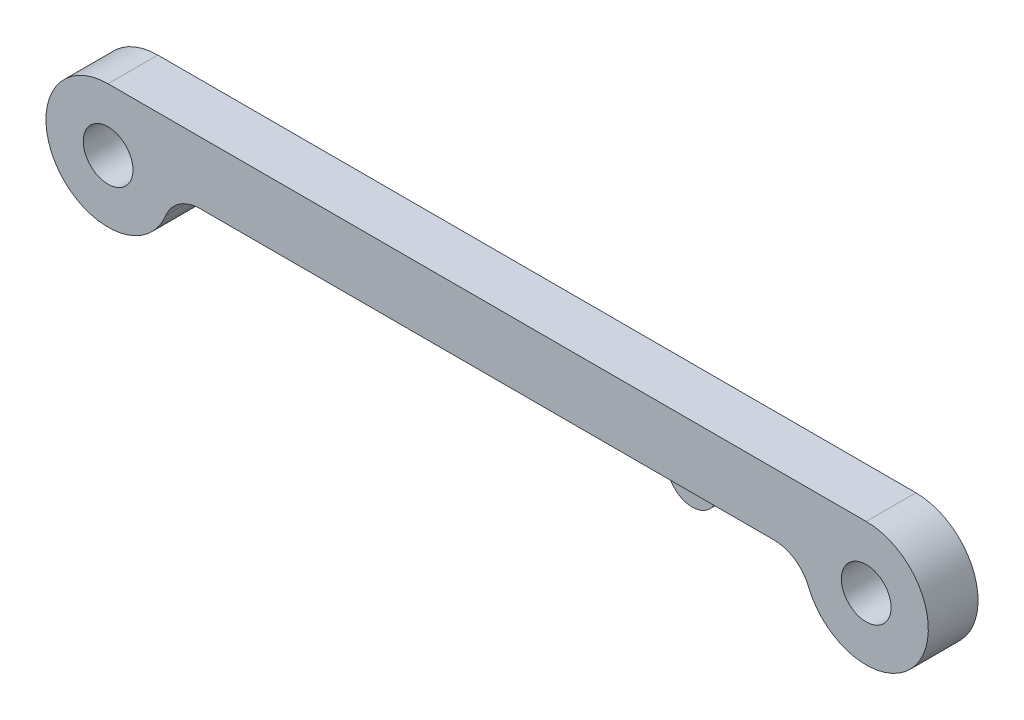
ISO-10303-21;
HEADER;
FILE_DESCRIPTION(('STEP AP214'),'2;1');
FILE_NAME('part.step','',(''),(''),'','','');
FILE_SCHEMA(('AUTOMOTIVE_DESIGN { 1 0 10303 214 1 1 1 1 }'));
ENDSEC;
DATA;
#1=APPLICATION_CONTEXT('core data for automotive mechanical design processes');
#2=APPLICATION_PROTOCOL_DEFINITION('international standard','automotive_design',2000,#1);
#3=PRODUCT_CONTEXT('',#1,'mechanical');
#4=PRODUCT('Part','Part','',(#3));
#5=PRODUCT_RELATED_PRODUCT_CATEGORY('part','',(#4));
#6=PRODUCT_DEFINITION_FORMATION('','',#4);
#7=PRODUCT_DEFINITION_CONTEXT('part definition',#1,'design');
#8=PRODUCT_DEFINITION('design','',#6,#7);
#9=PRODUCT_DEFINITION_SHAPE('','',#8);
#10=(LENGTH_UNIT() NAMED_UNIT(*) SI_UNIT(.MILLI.,.METRE.));
#11=(NAMED_UNIT(*) PLANE_ANGLE_UNIT() SI_UNIT($,.RADIAN.));
#12=(NAMED_UNIT(*) SI_UNIT($,.STERADIAN.) SOLID_ANGLE_UNIT());
#13=UNCERTAINTY_MEASURE_WITH_UNIT(LENGTH_MEASURE(1.E-05),#10,'distance_accuracy_value','');
#14=(GEOMETRIC_REPRESENTATION_CONTEXT(3) GLOBAL_UNCERTAINTY_ASSIGNED_CONTEXT((#13)) GLOBAL_UNIT_ASSIGNED_CONTEXT((#10,
#11,#12)) REPRESENTATION_CONTEXT('',''));
#15=CARTESIAN_POINT('',(0.,0.,0.));
#16=DIRECTION('',(0.,0.,1.));
#17=DIRECTION('',(1.,0.,0.));
#18=AXIS2_PLACEMENT_3D('',#15,#16,#17);
#19=CARTESIAN_POINT('',(-55.8049486568332,-3.5,4.));
#20=DIRECTION('',(0.,0.,1.));
#21=DIRECTION('',(1.,0.,0.));
#22=AXIS2_PLACEMENT_3D('',#19,#20,#21);
#23=PLANE('',#22);
#24=CARTESIAN_POINT('',(-63.2211471439288,-0.499999999999996,4.));
#25=DIRECTION('',(0.,0.,1.));
#26=DIRECTION('',(1.,0.,0.));
#27=AXIS2_PLACEMENT_3D('',#24,#25,#26);
#28=CIRCLE('',#27,2.);
#29=CARTESIAN_POINT('',(-61.2211471439288,-0.499999999999996,4.));
#30=VERTEX_POINT('',#29);
#31=EDGE_CURVE('E168',#30,#30,#28,.T.);
#32=ORIENTED_EDGE('',*,*,#31,.F.);
#33=EDGE_LOOP('',(#32));
#34=FACE_BOUND('',#33,.T.);
#35=CARTESIAN_POINT('',(-55.8049486568332,-3.5,4.));
#36=DIRECTION('',(0.,0.,-1.));
#37=DIRECTION('',(1.,0.,0.));
#38=AXIS2_PLACEMENT_3D('',#35,#36,#37);
#39=CIRCLE('',#38,3.);
#40=CARTESIAN_POINT('',(-58.586023089494,-2.375,4.));
#41=VERTEX_POINT('',#40);
#42=CARTESIAN_POINT('',(-55.8049486568332,-0.499999999999997,4.));
#43=VERTEX_POINT('',#42);
#44=EDGE_CURVE('E174',#41,#43,#39,.T.);
#45=ORIENTED_EDGE('',*,*,#44,.T.);
#46=DIRECTION('',(1.,0.,0.));
#47=VECTOR('',#46,1.);
#48=CARTESIAN_POINT('',(-55.8049486568332,-0.499999999999997,4.));
#49=LINE('',#48,#47);
#50=CARTESIAN_POINT('',(-9.63734563102448,-0.499999999999997,4.));
#51=VERTEX_POINT('',#50);
#52=EDGE_CURVE('E177',#43,#51,#49,.T.);
#53=ORIENTED_EDGE('',*,*,#52,.T.);
#54=CARTESIAN_POINT('',(-9.63734563102448,-3.5,4.));
#55=DIRECTION('',(0.,0.,-1.));
#56=DIRECTION('',(-1.,0.,0.));
#57=AXIS2_PLACEMENT_3D('',#54,#55,#56);
#58=CIRCLE('',#57,3.);
#59=CARTESIAN_POINT('',(-6.85627119836361,-2.375,4.));
#60=VERTEX_POINT('',#59);
#61=EDGE_CURVE('E180',#51,#60,#58,.T.);
#62=ORIENTED_EDGE('',*,*,#61,.T.);
#63=CARTESIAN_POINT('',(-2.22114714392882,-0.499999999999997,4.));
#64=DIRECTION('',(0.,0.,1.));
#65=DIRECTION('',(1.,0.,0.));
#66=AXIS2_PLACEMENT_3D('',#63,#64,#65);
#67=CIRCLE('',#66,5.);
#68=CARTESIAN_POINT('',(-2.22114714392882,4.5,4.));
#69=VERTEX_POINT('',#68);
#70=EDGE_CURVE('E182',#60,#69,#67,.T.);
#71=ORIENTED_EDGE('',*,*,#70,.T.);
#72=DIRECTION('',(-1.,0.,0.));
#73=VECTOR('',#72,1.);
#74=CARTESIAN_POINT('',(-63.2211471439288,4.5,4.));
#75=LINE('',#74,#73);
#76=CARTESIAN_POINT('',(-63.2211471439288,4.5,4.));
#77=VERTEX_POINT('',#76);
#78=EDGE_CURVE('E184',#69,#77,#75,.T.);
#79=ORIENTED_EDGE('',*,*,#78,.T.);
#80=CARTESIAN_POINT('',(-63.2211471439288,-0.499999999999996,4.));
#81=DIRECTION('',(0.,0.,1.));
#82=DIRECTION('',(1.,0.,0.));
#83=AXIS2_PLACEMENT_3D('',#80,#81,#82);
#84=CIRCLE('',#83,5.);
#85=EDGE_CURVE('E186',#77,#41,#84,.T.);
#86=ORIENTED_EDGE('',*,*,#85,.T.);
#87=EDGE_LOOP('',(#45,#53,#62,#71,#79,#86));
#88=FACE_BOUND('',#87,.T.);
#89=CARTESIAN_POINT('',(-2.22114714392882,-0.499999999999997,4.));
#90=DIRECTION('',(0.,0.,1.));
#91=DIRECTION('',(1.,0.,0.));
#92=AXIS2_PLACEMENT_3D('',#89,#90,#91);
#93=CIRCLE('',#92,2.);
#94=CARTESIAN_POINT('',(-0.221147143928817,-0.499999999999997,4.));
#95=VERTEX_POINT('',#94);
#96=EDGE_CURVE('E162',#95,#95,#93,.T.);
#97=ORIENTED_EDGE('',*,*,#96,.F.);
#98=EDGE_LOOP('',(#97));
#99=FACE_BOUND('',#98,.T.);
#100=ADVANCED_FACE('F36',(#34,#88,#99),#23,.T.);
#101=CARTESIAN_POINT('',(-55.8049486568332,-3.5,0.));
#102=DIRECTION('',(0.,0.,1.));
#103=DIRECTION('',(1.,0.,0.));
#104=AXIS2_PLACEMENT_3D('',#101,#102,#103);
#105=PLANE('',#104);
#106=CARTESIAN_POINT('',(-63.2211471439288,-0.499999999999996,0.));
#107=DIRECTION('',(0.,0.,1.));
#108=DIRECTION('',(1.,0.,0.));
#109=AXIS2_PLACEMENT_3D('',#106,#107,#108);
#110=CIRCLE('',#109,2.);
#111=CARTESIAN_POINT('',(-61.2211471439288,-0.499999999999996,0.));
#112=VERTEX_POINT('',#111);
#113=EDGE_CURVE('E165',#112,#112,#110,.T.);
#114=ORIENTED_EDGE('',*,*,#113,.T.);
#115=EDGE_LOOP('',(#114));
#116=FACE_BOUND('',#115,.T.);
#117=CARTESIAN_POINT('',(-55.8049486568332,-3.5,0.));
#118=DIRECTION('',(0.,0.,-1.));
#119=DIRECTION('',(1.,0.,0.));
#120=AXIS2_PLACEMENT_3D('',#117,#118,#119);
#121=CIRCLE('',#120,3.);
#122=CARTESIAN_POINT('',(-58.586023089494,-2.375,0.));
#123=VERTEX_POINT('',#122);
#124=CARTESIAN_POINT('',(-55.8049486568332,-0.499999999999997,0.));
#125=VERTEX_POINT('',#124);
#126=EDGE_CURVE('E171',#123,#125,#121,.T.);
#127=ORIENTED_EDGE('',*,*,#126,.F.);
#128=CARTESIAN_POINT('',(-63.2211471439288,-0.499999999999996,0.));
#129=DIRECTION('',(0.,0.,1.));
#130=DIRECTION('',(1.,0.,0.));
#131=AXIS2_PLACEMENT_3D('',#128,#129,#130);
#132=CIRCLE('',#131,5.);
#133=CARTESIAN_POINT('',(-63.2211471439288,4.5,0.));
#134=VERTEX_POINT('',#133);
#135=EDGE_CURVE('E178',#134,#123,#132,.T.);
#136=ORIENTED_EDGE('',*,*,#135,.F.);
#137=DIRECTION('',(-1.,0.,0.));
#138=VECTOR('',#137,1.);
#139=CARTESIAN_POINT('',(-63.2211471439288,4.5,0.));
#140=LINE('',#139,#138);
#141=CARTESIAN_POINT('',(-2.22114714392882,4.5,0.));
#142=VERTEX_POINT('',#141);
#143=EDGE_CURVE('E197',#142,#134,#140,.T.);
#144=ORIENTED_EDGE('',*,*,#143,.F.);
#145=CARTESIAN_POINT('',(-2.22114714392882,-0.499999999999997,0.));
#146=DIRECTION('',(0.,0.,1.));
#147=DIRECTION('',(1.,0.,0.));
#148=AXIS2_PLACEMENT_3D('',#145,#146,#147);
#149=CIRCLE('',#148,5.);
#150=CARTESIAN_POINT('',(-6.85627119836361,-2.375,0.));
#151=VERTEX_POINT('',#150);
#152=EDGE_CURVE('E195',#151,#142,#149,.T.);
#153=ORIENTED_EDGE('',*,*,#152,.F.);
#154=CARTESIAN_POINT('',(-9.63734563102448,-3.5,0.));
#155=DIRECTION('',(0.,0.,-1.));
#156=DIRECTION('',(-1.,0.,0.));
#157=AXIS2_PLACEMENT_3D('',#154,#155,#156);
#158=CIRCLE('',#157,3.);
#159=CARTESIAN_POINT('',(-9.63734563102448,-0.499999999999997,0.));
#160=VERTEX_POINT('',#159);
#161=EDGE_CURVE('E193',#160,#151,#158,.T.);
#162=ORIENTED_EDGE('',*,*,#161,.F.);
#163=DIRECTION('',(1.,0.,0.));
#164=VECTOR('',#163,1.);
#165=CARTESIAN_POINT('',(-55.8049486568332,-0.499999999999997,0.));
#166=LINE('',#165,#164);
#167=EDGE_CURVE('E191',#125,#160,#166,.T.);
#168=ORIENTED_EDGE('',*,*,#167,.F.);
#169=EDGE_LOOP('',(#127,#136,#144,#153,#162,#168));
#170=FACE_BOUND('',#169,.T.);
#171=CARTESIAN_POINT('',(-2.22114714392882,-0.499999999999997,0.));
#172=DIRECTION('',(0.,0.,1.));
#173=DIRECTION('',(1.,0.,0.));
#174=AXIS2_PLACEMENT_3D('',#171,#172,#173);
#175=CIRCLE('',#174,2.);
#176=CARTESIAN_POINT('',(-0.221147143928817,-0.499999999999997,0.));
#177=VERTEX_POINT('',#176);
#178=EDGE_CURVE('E160',#177,#177,#175,.T.);
#179=ORIENTED_EDGE('',*,*,#178,.T.);
#180=EDGE_LOOP('',(#179));
#181=FACE_BOUND('',#180,.T.);
#182=ADVANCED_FACE('F249',(#116,#170,#181),#105,.F.);
#183=CARTESIAN_POINT('',(-55.8049486568332,-3.5,4.));
#184=DIRECTION('',(0.,0.,-1.));
#185=DIRECTION('',(-1.,0.,0.));
#186=AXIS2_PLACEMENT_3D('',#183,#184,#185);
#187=CYLINDRICAL_SURFACE('',#186,3.);
#188=ORIENTED_EDGE('',*,*,#126,.T.);
#189=DIRECTION('',(0.,0.,-1.));
#190=VECTOR('',#189,1.);
#191=CARTESIAN_POINT('',(-55.8049486568332,-0.499999999999997,4.));
#192=LINE('',#191,#190);
#193=EDGE_CURVE('E148',#43,#125,#192,.T.);
#194=ORIENTED_EDGE('',*,*,#193,.F.);
#195=ORIENTED_EDGE('',*,*,#44,.F.);
#196=DIRECTION('',(0.,0.,-1.));
#197=VECTOR('',#196,1.);
#198=CARTESIAN_POINT('',(-58.586023089494,-2.375,4.));
#199=LINE('',#198,#197);
#200=EDGE_CURVE('E188',#41,#123,#199,.T.);
#201=ORIENTED_EDGE('',*,*,#200,.T.);
#202=EDGE_LOOP('',(#188,#194,#195,#201));
#203=FACE_BOUND('',#202,.T.);
#204=ADVANCED_FACE('F240',(#203),#187,.F.);
#205=CARTESIAN_POINT('',(-55.8049486568332,-0.499999999999997,4.));
#206=DIRECTION('',(0.,1.,0.));
#207=DIRECTION('',(0.,0.,1.));
#208=AXIS2_PLACEMENT_3D('',#205,#206,#207);
#209=PLANE('',#208);
#210=DIRECTION('',(0.,0.,1.));
#211=VECTOR('',#210,1.);
#212=CARTESIAN_POINT('',(-20.049574268675,-0.499999999999997,4.));
#213=LINE('',#212,#211);
#214=CARTESIAN_POINT('',(-20.049574268675,-0.499999999999997,1.));
#215=VERTEX_POINT('',#214);
#216=CARTESIAN_POINT('',(-20.049574268675,-0.499999999999997,3.));
#217=VERTEX_POINT('',#216);
#218=EDGE_CURVE('E220',#215,#217,#213,.T.);
#219=ORIENTED_EDGE('',*,*,#218,.T.);
#220=DIRECTION('',(1.,0.,0.));
#221=VECTOR('',#220,1.);
#222=CARTESIAN_POINT('',(-55.8049486568332,-0.499999999999997,3.));
#223=LINE('',#222,#221);
#224=CARTESIAN_POINT('',(-18.2211471439288,-0.499999999999997,3.));
#225=VERTEX_POINT('',#224);
#226=EDGE_CURVE('E216',#217,#225,#223,.T.);
#227=ORIENTED_EDGE('',*,*,#226,.T.);
#228=DIRECTION('',(0.,0.,1.));
#229=VECTOR('',#228,1.);
#230=CARTESIAN_POINT('',(-18.2211471439288,-0.499999999999997,1.));
#231=LINE('',#230,#229);
#232=CARTESIAN_POINT('',(-18.2211471439288,-0.499999999999997,1.));
#233=VERTEX_POINT('',#232);
#234=EDGE_CURVE('E136',#233,#225,#231,.T.);
#235=ORIENTED_EDGE('',*,*,#234,.F.);
#236=DIRECTION('',(1.,0.,0.));
#237=VECTOR('',#236,1.);
#238=CARTESIAN_POINT('',(-55.8049486568332,-0.499999999999997,1.));
#239=LINE('',#238,#237);
#240=EDGE_CURVE('E139',#215,#233,#239,.T.);
#241=ORIENTED_EDGE('',*,*,#240,.F.);
#242=EDGE_LOOP('',(#219,#227,#235,#241));
#243=FACE_BOUND('',#242,.T.);
#244=DIRECTION('',(0.,0.,1.));
#245=VECTOR('',#244,1.);
#246=CARTESIAN_POINT('',(-14.3927200191826,-0.499999999999997,4.));
#247=LINE('',#246,#245);
#248=CARTESIAN_POINT('',(-14.3927200191826,-0.499999999999997,3.));
#249=VERTEX_POINT('',#248);
#250=CARTESIAN_POINT('',(-14.3927200191826,-0.499999999999997,1.));
#251=VERTEX_POINT('',#250);
#252=EDGE_CURVE('E132',#249,#251,#247,.F.);
#253=ORIENTED_EDGE('',*,*,#252,.T.);
#254=CARTESIAN_POINT('',(-16.2211471439288,-0.499999999999997,1.));
#255=VERTEX_POINT('',#254);
#256=EDGE_CURVE('E125',#255,#251,#239,.T.);
#257=ORIENTED_EDGE('',*,*,#256,.F.);
#258=DIRECTION('',(0.,0.,1.));
#259=VECTOR('',#258,1.);
#260=CARTESIAN_POINT('',(-16.2211471439288,-0.499999999999997,1.));
#261=LINE('',#260,#259);
#262=CARTESIAN_POINT('',(-16.2211471439288,-0.499999999999997,3.));
#263=VERTEX_POINT('',#262);
#264=EDGE_CURVE('E129',#263,#255,#261,.F.);
#265=ORIENTED_EDGE('',*,*,#264,.F.);
#266=EDGE_CURVE('E137',#263,#249,#223,.T.);
#267=ORIENTED_EDGE('',*,*,#266,.T.);
#268=EDGE_LOOP('',(#253,#257,#265,#267));
#269=FACE_BOUND('',#268,.T.);
#270=ORIENTED_EDGE('',*,*,#167,.T.);
#271=DIRECTION('',(0.,0.,-1.));
#272=VECTOR('',#271,1.);
#273=CARTESIAN_POINT('',(-9.63734563102448,-0.499999999999997,4.));
#274=LINE('',#273,#272);
#275=EDGE_CURVE('E211',#51,#160,#274,.T.);
#276=ORIENTED_EDGE('',*,*,#275,.F.);
#277=ORIENTED_EDGE('',*,*,#52,.F.);
#278=ORIENTED_EDGE('',*,*,#193,.T.);
#279=EDGE_LOOP('',(#270,#276,#277,#278));
#280=FACE_BOUND('',#279,.T.);
#281=ADVANCED_FACE('F127',(#243,#269,#280),#209,.F.);
#282=CARTESIAN_POINT('',(-9.63734563102448,-3.5,4.));
#283=DIRECTION('',(0.,0.,-1.));
#284=DIRECTION('',(-1.,0.,0.));
#285=AXIS2_PLACEMENT_3D('',#282,#283,#284);
#286=CYLINDRICAL_SURFACE('',#285,3.);
#287=ORIENTED_EDGE('',*,*,#161,.T.);
#288=DIRECTION('',(0.,0.,-1.));
#289=VECTOR('',#288,1.);
#290=CARTESIAN_POINT('',(-6.85627119836361,-2.375,4.));
#291=LINE('',#290,#289);
#292=EDGE_CURVE('E208',#60,#151,#291,.T.);
#293=ORIENTED_EDGE('',*,*,#292,.F.);
#294=ORIENTED_EDGE('',*,*,#61,.F.);
#295=ORIENTED_EDGE('',*,*,#275,.T.);
#296=EDGE_LOOP('',(#287,#293,#294,#295));
#297=FACE_BOUND('',#296,.T.);
#298=ADVANCED_FACE('F239',(#297),#286,.F.);
#299=CARTESIAN_POINT('',(-2.22114714392882,-0.499999999999997,4.));
#300=DIRECTION('',(0.,0.,-1.));
#301=DIRECTION('',(-1.,0.,0.));
#302=AXIS2_PLACEMENT_3D('',#299,#300,#301);
#303=CYLINDRICAL_SURFACE('',#302,5.);
#304=ORIENTED_EDGE('',*,*,#152,.T.);
#305=DIRECTION('',(0.,0.,-1.));
#306=VECTOR('',#305,1.);
#307=CARTESIAN_POINT('',(-2.22114714392882,4.5,4.));
#308=LINE('',#307,#306);
#309=EDGE_CURVE('E205',#69,#142,#308,.T.);
#310=ORIENTED_EDGE('',*,*,#309,.F.);
#311=ORIENTED_EDGE('',*,*,#70,.F.);
#312=ORIENTED_EDGE('',*,*,#292,.T.);
#313=EDGE_LOOP('',(#304,#310,#311,#312));
#314=FACE_BOUND('',#313,.T.);
#315=ADVANCED_FACE('F246',(#314),#303,.T.);
#316=CARTESIAN_POINT('',(-63.2211471439288,4.5,4.));
#317=DIRECTION('',(0.,-1.,0.));
#318=DIRECTION('',(1.,0.,0.));
#319=AXIS2_PLACEMENT_3D('',#316,#317,#318);
#320=PLANE('',#319);
#321=ORIENTED_EDGE('',*,*,#143,.T.);
#322=DIRECTION('',(0.,0.,-1.));
#323=VECTOR('',#322,1.);
#324=CARTESIAN_POINT('',(-63.2211471439288,4.5,4.));
#325=LINE('',#324,#323);
#326=EDGE_CURVE('E202',#77,#134,#325,.T.);
#327=ORIENTED_EDGE('',*,*,#326,.F.);
#328=ORIENTED_EDGE('',*,*,#78,.F.);
#329=ORIENTED_EDGE('',*,*,#309,.T.);
#330=EDGE_LOOP('',(#321,#327,#328,#329));
#331=FACE_BOUND('',#330,.T.);
#332=ADVANCED_FACE('F269',(#331),#320,.F.);
#333=CARTESIAN_POINT('',(-63.2211471439288,-0.499999999999996,4.));
#334=DIRECTION('',(0.,0.,-1.));
#335=DIRECTION('',(-1.,0.,0.));
#336=AXIS2_PLACEMENT_3D('',#333,#334,#335);
#337=CYLINDRICAL_SURFACE('',#336,5.);
#338=ORIENTED_EDGE('',*,*,#135,.T.);
#339=ORIENTED_EDGE('',*,*,#200,.F.);
#340=ORIENTED_EDGE('',*,*,#85,.F.);
#341=ORIENTED_EDGE('',*,*,#326,.T.);
#342=EDGE_LOOP('',(#338,#339,#340,#341));
#343=FACE_BOUND('',#342,.T.);
#344=ADVANCED_FACE('F266',(#343),#337,.T.);
#345=CARTESIAN_POINT('',(-63.2211471439288,-0.499999999999996,4.));
#346=DIRECTION('',(0.,0.,-1.));
#347=DIRECTION('',(-1.,0.,0.));
#348=AXIS2_PLACEMENT_3D('',#345,#346,#347);
#349=CYLINDRICAL_SURFACE('',#348,2.);
#350=ORIENTED_EDGE('',*,*,#31,.T.);
#351=EDGE_LOOP('',(#350));
#352=FACE_BOUND('',#351,.T.);
#353=ORIENTED_EDGE('',*,*,#113,.F.);
#354=EDGE_LOOP('',(#353));
#355=FACE_BOUND('',#354,.T.);
#356=ADVANCED_FACE('F263',(#352,#355),#349,.F.);
#357=CARTESIAN_POINT('',(-2.22114714392882,-0.499999999999997,4.));
#358=DIRECTION('',(0.,0.,-1.));
#359=DIRECTION('',(-1.,0.,0.));
#360=AXIS2_PLACEMENT_3D('',#357,#358,#359);
#361=CYLINDRICAL_SURFACE('',#360,2.);
#362=ORIENTED_EDGE('',*,*,#96,.T.);
#363=EDGE_LOOP('',(#362));
#364=FACE_BOUND('',#363,.T.);
#365=ORIENTED_EDGE('',*,*,#178,.F.);
#366=EDGE_LOOP('',(#365));
#367=FACE_BOUND('',#366,.T.);
#368=ADVANCED_FACE('F299',(#364,#367),#361,.F.);
#369=CARTESIAN_POINT('',(-17.2211471439288,-0.499999999999997,1.));
#370=DIRECTION('',(0.,0.,1.));
#371=DIRECTION('',(1.,0.,0.));
#372=AXIS2_PLACEMENT_3D('',#369,#370,#371);
#373=CYLINDRICAL_SURFACE('',#372,2.);
#374=CARTESIAN_POINT('',(-17.2211471439288,-0.499999999999997,3.));
#375=DIRECTION('',(0.,0.,1.));
#376=DIRECTION('',(1.,0.,0.));
#377=AXIS2_PLACEMENT_3D('',#374,#375,#376);
#378=CIRCLE('',#377,2.);
#379=CARTESIAN_POINT('',(-19.1067652270929,-1.16666666666666,3.));
#380=VERTEX_POINT('',#379);
#381=CARTESIAN_POINT('',(-15.3355290607647,-1.16666666666666,3.));
#382=VERTEX_POINT('',#381);
#383=EDGE_CURVE('E154',#380,#382,#378,.T.);
#384=ORIENTED_EDGE('',*,*,#383,.F.);
#385=DIRECTION('',(0.,0.,1.));
#386=VECTOR('',#385,1.);
#387=CARTESIAN_POINT('',(-19.1067652270929,-1.16666666666666,1.));
#388=LINE('',#387,#386);
#389=CARTESIAN_POINT('',(-19.1067652270929,-1.16666666666666,1.));
#390=VERTEX_POINT('',#389);
#391=EDGE_CURVE('E224',#380,#390,#388,.F.);
#392=ORIENTED_EDGE('',*,*,#391,.T.);
#393=CARTESIAN_POINT('',(-17.2211471439288,-0.499999999999997,1.));
#394=DIRECTION('',(0.,0.,1.));
#395=DIRECTION('',(1.,0.,0.));
#396=AXIS2_PLACEMENT_3D('',#393,#394,#395);
#397=CIRCLE('',#396,2.);
#398=CARTESIAN_POINT('',(-15.3355290607647,-1.16666666666666,1.));
#399=VERTEX_POINT('',#398);
#400=EDGE_CURVE('E156',#390,#399,#397,.T.);
#401=ORIENTED_EDGE('',*,*,#400,.T.);
#402=DIRECTION('',(0.,0.,1.));
#403=VECTOR('',#402,1.);
#404=CARTESIAN_POINT('',(-15.3355290607647,-1.16666666666666,1.));
#405=LINE('',#404,#403);
#406=EDGE_CURVE('E51',#399,#382,#405,.T.);
#407=ORIENTED_EDGE('',*,*,#406,.T.);
#408=EDGE_LOOP('',(#384,#392,#401,#407));
#409=FACE_BOUND('',#408,.T.);
#410=ADVANCED_FACE('F230',(#409),#373,.T.);
#411=CARTESIAN_POINT('',(-17.2211471439288,-0.499999999999997,1.));
#412=DIRECTION('',(0.,0.,1.));
#413=DIRECTION('',(1.,0.,0.));
#414=AXIS2_PLACEMENT_3D('',#411,#412,#413);
#415=PLANE('',#414);
#416=ORIENTED_EDGE('',*,*,#400,.F.);
#417=CARTESIAN_POINT('',(-20.049574268675,-1.5,1.));
#418=DIRECTION('',(0.,0.,1.));
#419=DIRECTION('',(1.,0.,0.));
#420=AXIS2_PLACEMENT_3D('',#417,#418,#419);
#421=CIRCLE('',#420,1.);
#422=EDGE_CURVE('E227',#390,#215,#421,.T.);
#423=ORIENTED_EDGE('',*,*,#422,.T.);
#424=ORIENTED_EDGE('',*,*,#240,.T.);
#425=CARTESIAN_POINT('',(-17.2211471439288,-0.499999999999997,1.));
#426=DIRECTION('',(0.,0.,1.));
#427=DIRECTION('',(1.,0.,0.));
#428=AXIS2_PLACEMENT_3D('',#425,#426,#427);
#429=CIRCLE('',#428,1.);
#430=EDGE_CURVE('E145',#233,#255,#429,.T.);
#431=ORIENTED_EDGE('',*,*,#430,.T.);
#432=ORIENTED_EDGE('',*,*,#256,.T.);
#433=CARTESIAN_POINT('',(-14.3927200191826,-1.5,1.));
#434=DIRECTION('',(0.,0.,1.));
#435=DIRECTION('',(1.,0.,0.));
#436=AXIS2_PLACEMENT_3D('',#433,#434,#435);
#437=CIRCLE('',#436,1.);
#438=EDGE_CURVE('E44',#251,#399,#437,.T.);
#439=ORIENTED_EDGE('',*,*,#438,.T.);
#440=EDGE_LOOP('',(#416,#423,#424,#431,#432,#439));
#441=FACE_BOUND('',#440,.T.);
#442=ADVANCED_FACE('F152',(#441),#415,.F.);
#443=CARTESIAN_POINT('',(-17.2211471439288,-0.499999999999997,3.));
#444=DIRECTION('',(0.,0.,1.));
#445=DIRECTION('',(1.,0.,0.));
#446=AXIS2_PLACEMENT_3D('',#443,#444,#445);
#447=PLANE('',#446);
#448=ORIENTED_EDGE('',*,*,#226,.F.);
#449=CARTESIAN_POINT('',(-20.049574268675,-1.5,3.));
#450=DIRECTION('',(0.,0.,1.));
#451=DIRECTION('',(1.,0.,0.));
#452=AXIS2_PLACEMENT_3D('',#449,#450,#451);
#453=CIRCLE('',#452,1.);
#454=EDGE_CURVE('E58',#217,#380,#453,.F.);
#455=ORIENTED_EDGE('',*,*,#454,.T.);
#456=ORIENTED_EDGE('',*,*,#383,.T.);
#457=CARTESIAN_POINT('',(-14.3927200191826,-1.5,3.));
#458=DIRECTION('',(0.,0.,1.));
#459=DIRECTION('',(1.,0.,0.));
#460=AXIS2_PLACEMENT_3D('',#457,#458,#459);
#461=CIRCLE('',#460,1.);
#462=EDGE_CURVE('E11',#382,#249,#461,.F.);
#463=ORIENTED_EDGE('',*,*,#462,.T.);
#464=ORIENTED_EDGE('',*,*,#266,.F.);
#465=CARTESIAN_POINT('',(-17.2211471439288,-0.499999999999997,3.));
#466=DIRECTION('',(0.,0.,1.));
#467=DIRECTION('',(1.,0.,0.));
#468=AXIS2_PLACEMENT_3D('',#465,#466,#467);
#469=CIRCLE('',#468,1.);
#470=EDGE_CURVE('E147',#225,#263,#469,.T.);
#471=ORIENTED_EDGE('',*,*,#470,.F.);
#472=EDGE_LOOP('',(#448,#455,#456,#463,#464,#471));
#473=FACE_BOUND('',#472,.T.);
#474=ADVANCED_FACE('F233',(#473),#447,.T.);
#475=CARTESIAN_POINT('',(-17.2211471439288,-0.499999999999997,1.));
#476=DIRECTION('',(0.,0.,1.));
#477=DIRECTION('',(1.,0.,0.));
#478=AXIS2_PLACEMENT_3D('',#475,#476,#477);
#479=CYLINDRICAL_SURFACE('',#478,1.);
#480=ORIENTED_EDGE('',*,*,#430,.F.);
#481=ORIENTED_EDGE('',*,*,#234,.T.);
#482=ORIENTED_EDGE('',*,*,#470,.T.);
#483=ORIENTED_EDGE('',*,*,#264,.T.);
#484=EDGE_LOOP('',(#480,#481,#482,#483));
#485=FACE_BOUND('',#484,.T.);
#486=ADVANCED_FACE('F143',(#485),#479,.F.);
#487=CARTESIAN_POINT('',(-20.049574268675,-1.5,1.));
#488=DIRECTION('',(0.,0.,1.));
#489=DIRECTION('',(1.,0.,0.));
#490=AXIS2_PLACEMENT_3D('',#487,#488,#489);
#491=CYLINDRICAL_SURFACE('',#490,1.);
#492=ORIENTED_EDGE('',*,*,#422,.F.);
#493=ORIENTED_EDGE('',*,*,#391,.F.);
#494=ORIENTED_EDGE('',*,*,#454,.F.);
#495=ORIENTED_EDGE('',*,*,#218,.F.);
#496=EDGE_LOOP('',(#492,#493,#494,#495));
#497=FACE_BOUND('',#496,.T.);
#498=ADVANCED_FACE('F235',(#497),#491,.F.);
#499=CARTESIAN_POINT('',(-14.3927200191826,-1.5,1.));
#500=DIRECTION('',(0.,0.,1.));
#501=DIRECTION('',(1.,0.,0.));
#502=AXIS2_PLACEMENT_3D('',#499,#500,#501);
#503=CYLINDRICAL_SURFACE('',#502,1.);
#504=ORIENTED_EDGE('',*,*,#462,.F.);
#505=ORIENTED_EDGE('',*,*,#406,.F.);
#506=ORIENTED_EDGE('',*,*,#438,.F.);
#507=ORIENTED_EDGE('',*,*,#252,.F.);
#508=EDGE_LOOP('',(#504,#505,#506,#507));
#509=FACE_BOUND('',#508,.T.);
#510=ADVANCED_FACE('F38',(#509),#503,.F.);
#511=CLOSED_SHELL('',(#100,#182,#204,#281,#298,#315,#332,#344,#356,#368,#410,#442,#474,#486,
#498,#510));
#512=MANIFOLD_SOLID_BREP('B2',#511);
#513=ADVANCED_BREP_SHAPE_REPRESENTATION('',(#18,#512),#14);
#514=SHAPE_DEFINITION_REPRESENTATION(#9,#513);
ENDSEC;
END-ISO-10303-21;
